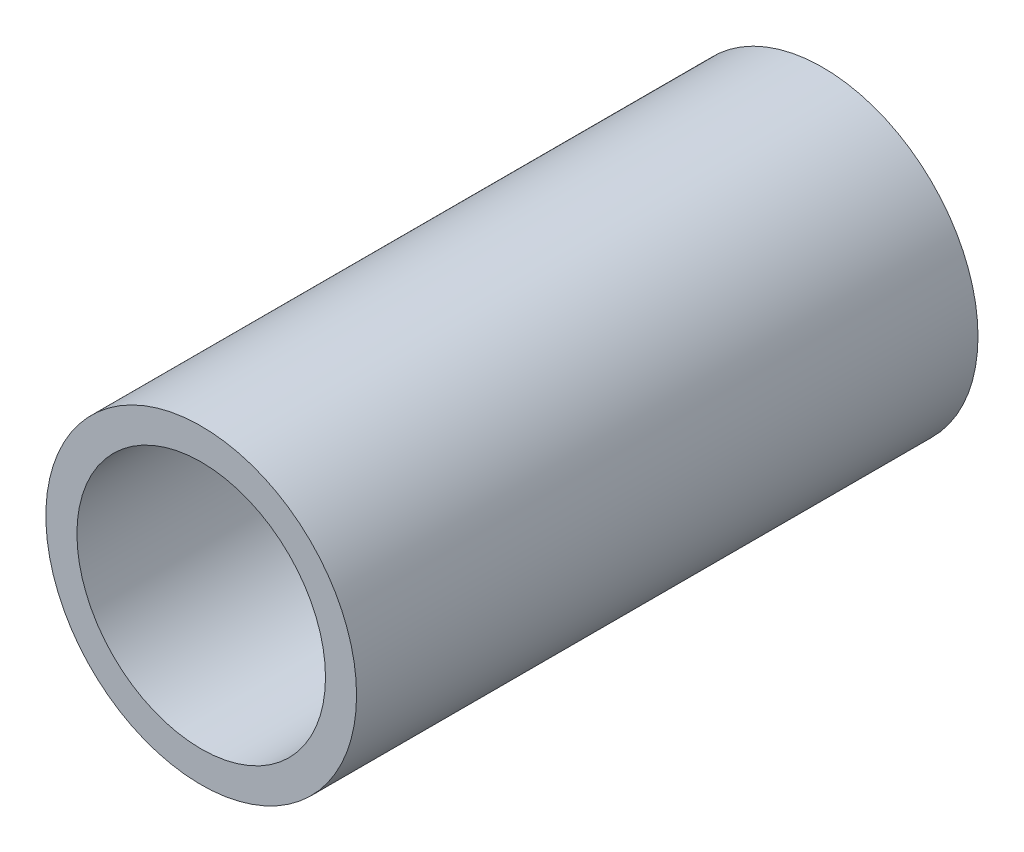
ISO-10303-21;
HEADER;
FILE_DESCRIPTION(('STEP AP214'),'2;1');
FILE_NAME('part.step','',(''),(''),'','','');
FILE_SCHEMA(('AUTOMOTIVE_DESIGN { 1 0 10303 214 1 1 1 1 }'));
ENDSEC;
DATA;
#1=APPLICATION_CONTEXT('core data for automotive mechanical design processes');
#2=APPLICATION_PROTOCOL_DEFINITION('international standard','automotive_design',2000,#1);
#3=PRODUCT_CONTEXT('',#1,'mechanical');
#4=PRODUCT('Part','Part','',(#3));
#5=PRODUCT_RELATED_PRODUCT_CATEGORY('part','',(#4));
#6=PRODUCT_DEFINITION_FORMATION('','',#4);
#7=PRODUCT_DEFINITION_CONTEXT('part definition',#1,'design');
#8=PRODUCT_DEFINITION('design','',#6,#7);
#9=PRODUCT_DEFINITION_SHAPE('','',#8);
#10=(LENGTH_UNIT() NAMED_UNIT(*) SI_UNIT(.MILLI.,.METRE.));
#11=(NAMED_UNIT(*) PLANE_ANGLE_UNIT() SI_UNIT($,.RADIAN.));
#12=(NAMED_UNIT(*) SI_UNIT($,.STERADIAN.) SOLID_ANGLE_UNIT());
#13=UNCERTAINTY_MEASURE_WITH_UNIT(LENGTH_MEASURE(1.E-05),#10,'distance_accuracy_value','');
#14=(GEOMETRIC_REPRESENTATION_CONTEXT(3) GLOBAL_UNCERTAINTY_ASSIGNED_CONTEXT((#13)) GLOBAL_UNIT_ASSIGNED_CONTEXT((#10,
#11,#12)) REPRESENTATION_CONTEXT('',''));
#15=CARTESIAN_POINT('',(0.,0.,0.));
#16=DIRECTION('',(0.,0.,1.));
#17=DIRECTION('',(1.,0.,0.));
#18=AXIS2_PLACEMENT_3D('',#15,#16,#17);
#19=CARTESIAN_POINT('',(0.,0.,50.));
#20=DIRECTION('',(0.,0.,1.));
#21=DIRECTION('',(1.,0.,0.));
#22=AXIS2_PLACEMENT_3D('',#19,#20,#21);
#23=PLANE('',#22);
#24=CARTESIAN_POINT('',(0.,0.,50.));
#25=DIRECTION('',(0.,0.,1.));
#26=DIRECTION('',(1.,0.,0.));
#27=AXIS2_PLACEMENT_3D('',#24,#25,#26);
#28=CIRCLE('',#27,12.5);
#29=CARTESIAN_POINT('',(12.5,0.,50.));
#30=VERTEX_POINT('',#29);
#31=EDGE_CURVE('E10',#30,#30,#28,.T.);
#32=ORIENTED_EDGE('',*,*,#31,.T.);
#33=EDGE_LOOP('',(#32));
#34=FACE_BOUND('',#33,.T.);
#35=CARTESIAN_POINT('',(0.,0.,50.));
#36=DIRECTION('',(0.,0.,1.));
#37=DIRECTION('',(1.,0.,0.));
#38=AXIS2_PLACEMENT_3D('',#35,#36,#37);
#39=CIRCLE('',#38,10.);
#40=CARTESIAN_POINT('',(10.,0.,50.));
#41=VERTEX_POINT('',#40);
#42=EDGE_CURVE('E52',#41,#41,#39,.T.);
#43=ORIENTED_EDGE('',*,*,#42,.F.);
#44=EDGE_LOOP('',(#43));
#45=FACE_BOUND('',#44,.T.);
#46=ADVANCED_FACE('F39',(#34,#45),#23,.T.);
#47=CARTESIAN_POINT('',(0.,0.,0.));
#48=DIRECTION('',(0.,0.,1.));
#49=DIRECTION('',(1.,0.,0.));
#50=AXIS2_PLACEMENT_3D('',#47,#48,#49);
#51=PLANE('',#50);
#52=CARTESIAN_POINT('',(0.,0.,0.));
#53=DIRECTION('',(0.,0.,1.));
#54=DIRECTION('',(1.,0.,0.));
#55=AXIS2_PLACEMENT_3D('',#52,#53,#54);
#56=CIRCLE('',#55,12.5);
#57=CARTESIAN_POINT('',(12.5,0.,0.));
#58=VERTEX_POINT('',#57);
#59=EDGE_CURVE('E43',#58,#58,#56,.T.);
#60=ORIENTED_EDGE('',*,*,#59,.F.);
#61=EDGE_LOOP('',(#60));
#62=FACE_BOUND('',#61,.T.);
#63=CARTESIAN_POINT('',(0.,0.,0.));
#64=DIRECTION('',(0.,0.,1.));
#65=DIRECTION('',(1.,0.,0.));
#66=AXIS2_PLACEMENT_3D('',#63,#64,#65);
#67=CIRCLE('',#66,10.);
#68=CARTESIAN_POINT('',(10.,0.,0.));
#69=VERTEX_POINT('',#68);
#70=EDGE_CURVE('E54',#69,#69,#67,.T.);
#71=ORIENTED_EDGE('',*,*,#70,.T.);
#72=EDGE_LOOP('',(#71));
#73=FACE_BOUND('',#72,.T.);
#74=ADVANCED_FACE('F66',(#62,#73),#51,.F.);
#75=CARTESIAN_POINT('',(0.,0.,50.));
#76=DIRECTION('',(0.,0.,-1.));
#77=DIRECTION('',(-1.,0.,0.));
#78=AXIS2_PLACEMENT_3D('',#75,#76,#77);
#79=CYLINDRICAL_SURFACE('',#78,12.5);
#80=ORIENTED_EDGE('',*,*,#31,.F.);
#81=EDGE_LOOP('',(#80));
#82=FACE_BOUND('',#81,.T.);
#83=ORIENTED_EDGE('',*,*,#59,.T.);
#84=EDGE_LOOP('',(#83));
#85=FACE_BOUND('',#84,.T.);
#86=ADVANCED_FACE('F41',(#82,#85),#79,.T.);
#87=CARTESIAN_POINT('',(0.,0.,50.));
#88=DIRECTION('',(0.,0.,-1.));
#89=DIRECTION('',(-1.,0.,0.));
#90=AXIS2_PLACEMENT_3D('',#87,#88,#89);
#91=CYLINDRICAL_SURFACE('',#90,10.);
#92=ORIENTED_EDGE('',*,*,#42,.T.);
#93=EDGE_LOOP('',(#92));
#94=FACE_BOUND('',#93,.T.);
#95=ORIENTED_EDGE('',*,*,#70,.F.);
#96=EDGE_LOOP('',(#95));
#97=FACE_BOUND('',#96,.T.);
#98=ADVANCED_FACE('F62',(#94,#97),#91,.F.);
#99=CLOSED_SHELL('',(#46,#74,#86,#98));
#100=MANIFOLD_SOLID_BREP('B2',#99);
#101=ADVANCED_BREP_SHAPE_REPRESENTATION('',(#18,#100),#14);
#102=SHAPE_DEFINITION_REPRESENTATION(#9,#101);
ENDSEC;
END-ISO-10303-21;
